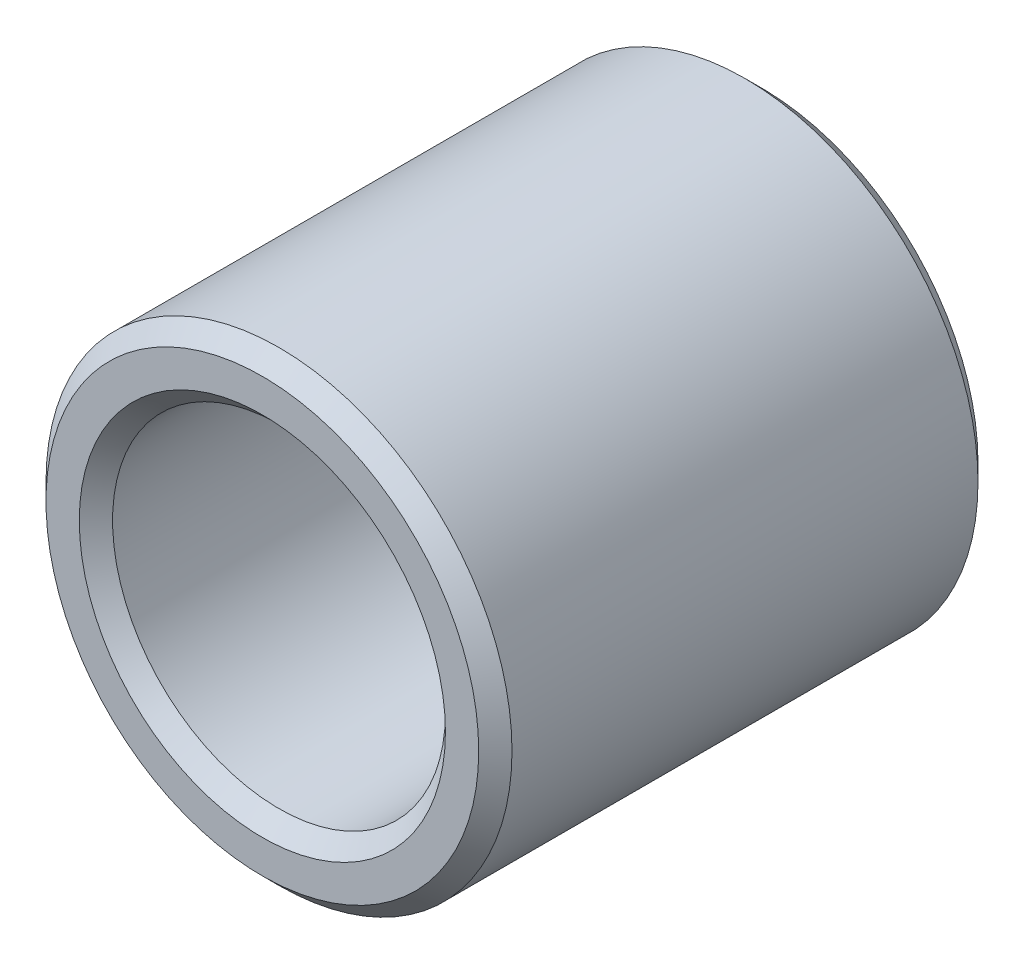
ISO-10303-21;
HEADER;
FILE_DESCRIPTION(('STEP AP214'),'2;1');
FILE_NAME('part.step','',(''),(''),'','','');
FILE_SCHEMA(('AUTOMOTIVE_DESIGN { 1 0 10303 214 1 1 1 1 }'));
ENDSEC;
DATA;
#1=APPLICATION_CONTEXT('core data for automotive mechanical design processes');
#2=APPLICATION_PROTOCOL_DEFINITION('international standard','automotive_design',2000,#1);
#3=PRODUCT_CONTEXT('',#1,'mechanical');
#4=PRODUCT('Part','Part','',(#3));
#5=PRODUCT_RELATED_PRODUCT_CATEGORY('part','',(#4));
#6=PRODUCT_DEFINITION_FORMATION('','',#4);
#7=PRODUCT_DEFINITION_CONTEXT('part definition',#1,'design');
#8=PRODUCT_DEFINITION('design','',#6,#7);
#9=PRODUCT_DEFINITION_SHAPE('','',#8);
#10=(LENGTH_UNIT() NAMED_UNIT(*) SI_UNIT(.MILLI.,.METRE.));
#11=(NAMED_UNIT(*) PLANE_ANGLE_UNIT() SI_UNIT($,.RADIAN.));
#12=(NAMED_UNIT(*) SI_UNIT($,.STERADIAN.) SOLID_ANGLE_UNIT());
#13=UNCERTAINTY_MEASURE_WITH_UNIT(LENGTH_MEASURE(1.E-05),#10,'distance_accuracy_value','');
#14=(GEOMETRIC_REPRESENTATION_CONTEXT(3) GLOBAL_UNCERTAINTY_ASSIGNED_CONTEXT((#13)) GLOBAL_UNIT_ASSIGNED_CONTEXT((#10,
#11,#12)) REPRESENTATION_CONTEXT('',''));
#15=CARTESIAN_POINT('',(0.,0.,0.));
#16=DIRECTION('',(0.,0.,1.));
#17=DIRECTION('',(1.,0.,0.));
#18=AXIS2_PLACEMENT_3D('',#15,#16,#17);
#19=CARTESIAN_POINT('',(0.,0.,15.));
#20=DIRECTION('',(0.,0.,1.));
#21=DIRECTION('',(1.,0.,0.));
#22=AXIS2_PLACEMENT_3D('',#19,#20,#21);
#23=PLANE('',#22);
#24=CARTESIAN_POINT('',(0.,0.,15.));
#25=DIRECTION('',(0.,0.,1.));
#26=DIRECTION('',(1.,0.,0.));
#27=AXIS2_PLACEMENT_3D('',#24,#25,#26);
#28=CIRCLE('',#27,5.5);
#29=CARTESIAN_POINT('',(5.5,0.,15.));
#30=VERTEX_POINT('',#29);
#31=EDGE_CURVE('E10',#30,#30,#28,.F.);
#32=ORIENTED_EDGE('',*,*,#31,.T.);
#33=EDGE_LOOP('',(#32));
#34=FACE_BOUND('',#33,.T.);
#35=CARTESIAN_POINT('',(0.,0.,15.));
#36=DIRECTION('',(0.,0.,1.));
#37=DIRECTION('',(1.,0.,0.));
#38=AXIS2_PLACEMENT_3D('',#35,#36,#37);
#39=CIRCLE('',#38,6.5);
#40=CARTESIAN_POINT('',(6.5,0.,15.));
#41=VERTEX_POINT('',#40);
#42=EDGE_CURVE('E44',#41,#41,#39,.T.);
#43=ORIENTED_EDGE('',*,*,#42,.T.);
#44=EDGE_LOOP('',(#43));
#45=FACE_BOUND('',#44,.T.);
#46=ADVANCED_FACE('F36',(#34,#45),#23,.T.);
#47=CARTESIAN_POINT('',(0.,0.,0.));
#48=DIRECTION('',(0.,0.,1.));
#49=DIRECTION('',(1.,0.,0.));
#50=AXIS2_PLACEMENT_3D('',#47,#48,#49);
#51=PLANE('',#50);
#52=CARTESIAN_POINT('',(0.,0.,0.));
#53=DIRECTION('',(0.,0.,1.));
#54=DIRECTION('',(1.,0.,0.));
#55=AXIS2_PLACEMENT_3D('',#52,#53,#54);
#56=CIRCLE('',#55,5.5);
#57=CARTESIAN_POINT('',(5.5,0.,0.));
#58=VERTEX_POINT('',#57);
#59=EDGE_CURVE('E63',#58,#58,#56,.T.);
#60=ORIENTED_EDGE('',*,*,#59,.T.);
#61=EDGE_LOOP('',(#60));
#62=FACE_BOUND('',#61,.T.);
#63=CARTESIAN_POINT('',(0.,0.,0.));
#64=DIRECTION('',(0.,0.,1.));
#65=DIRECTION('',(1.,0.,0.));
#66=AXIS2_PLACEMENT_3D('',#63,#64,#65);
#67=CIRCLE('',#66,6.5);
#68=CARTESIAN_POINT('',(6.5,0.,0.));
#69=VERTEX_POINT('',#68);
#70=EDGE_CURVE('E66',#69,#69,#67,.F.);
#71=ORIENTED_EDGE('',*,*,#70,.T.);
#72=EDGE_LOOP('',(#71));
#73=FACE_BOUND('',#72,.T.);
#74=ADVANCED_FACE('F70',(#62,#73),#51,.F.);
#75=CARTESIAN_POINT('',(0.,0.,15.));
#76=DIRECTION('',(0.,0.,-1.));
#77=DIRECTION('',(-1.,0.,0.));
#78=AXIS2_PLACEMENT_3D('',#75,#76,#77);
#79=CYLINDRICAL_SURFACE('',#78,7.);
#80=CARTESIAN_POINT('',(0.,0.,0.5));
#81=DIRECTION('',(0.,0.,1.));
#82=DIRECTION('',(1.,0.,0.));
#83=AXIS2_PLACEMENT_3D('',#80,#81,#82);
#84=CIRCLE('',#83,7.);
#85=CARTESIAN_POINT('',(7.,0.,0.5));
#86=VERTEX_POINT('',#85);
#87=EDGE_CURVE('E48',#86,#86,#84,.T.);
#88=ORIENTED_EDGE('',*,*,#87,.T.);
#89=EDGE_LOOP('',(#88));
#90=FACE_BOUND('',#89,.T.);
#91=CARTESIAN_POINT('',(0.,0.,14.5));
#92=DIRECTION('',(0.,0.,1.));
#93=DIRECTION('',(1.,0.,0.));
#94=AXIS2_PLACEMENT_3D('',#91,#92,#93);
#95=CIRCLE('',#94,7.);
#96=CARTESIAN_POINT('',(7.,0.,14.5));
#97=VERTEX_POINT('',#96);
#98=EDGE_CURVE('E52',#97,#97,#95,.F.);
#99=ORIENTED_EDGE('',*,*,#98,.T.);
#100=EDGE_LOOP('',(#99));
#101=FACE_BOUND('',#100,.T.);
#102=ADVANCED_FACE('F80',(#90,#101),#79,.T.);
#103=CARTESIAN_POINT('',(0.,0.,15.));
#104=DIRECTION('',(0.,0.,-1.));
#105=DIRECTION('',(-1.,0.,0.));
#106=AXIS2_PLACEMENT_3D('',#103,#104,#105);
#107=CYLINDRICAL_SURFACE('',#106,5.);
#108=CARTESIAN_POINT('',(0.,0.,0.499999999999997));
#109=DIRECTION('',(0.,0.,1.));
#110=DIRECTION('',(1.,0.,0.));
#111=AXIS2_PLACEMENT_3D('',#108,#109,#110);
#112=CIRCLE('',#111,5.);
#113=CARTESIAN_POINT('',(5.,0.,0.499999999999997));
#114=VERTEX_POINT('',#113);
#115=EDGE_CURVE('E57',#114,#114,#112,.F.);
#116=ORIENTED_EDGE('',*,*,#115,.T.);
#117=EDGE_LOOP('',(#116));
#118=FACE_BOUND('',#117,.T.);
#119=CARTESIAN_POINT('',(0.,0.,14.5));
#120=DIRECTION('',(0.,0.,1.));
#121=DIRECTION('',(1.,0.,0.));
#122=AXIS2_PLACEMENT_3D('',#119,#120,#121);
#123=CIRCLE('',#122,5.);
#124=CARTESIAN_POINT('',(5.,0.,14.5));
#125=VERTEX_POINT('',#124);
#126=EDGE_CURVE('E60',#125,#125,#123,.T.);
#127=ORIENTED_EDGE('',*,*,#126,.T.);
#128=EDGE_LOOP('',(#127));
#129=FACE_BOUND('',#128,.T.);
#130=ADVANCED_FACE('F83',(#118,#129),#107,.F.);
#131=CARTESIAN_POINT('',(0.,0.,0.));
#132=DIRECTION('',(0.,0.,-1.));
#133=DIRECTION('',(-1.,0.,0.));
#134=AXIS2_PLACEMENT_3D('',#131,#132,#133);
#135=CONICAL_SURFACE('',#134,5.5,0.785398163397449);
#136=ORIENTED_EDGE('',*,*,#115,.F.);
#137=EDGE_LOOP('',(#136));
#138=FACE_BOUND('',#137,.T.);
#139=ORIENTED_EDGE('',*,*,#59,.F.);
#140=EDGE_LOOP('',(#139));
#141=FACE_BOUND('',#140,.T.);
#142=ADVANCED_FACE('F76',(#138,#141),#135,.F.);
#143=CARTESIAN_POINT('',(0.,0.,0.5));
#144=DIRECTION('',(0.,0.,1.));
#145=DIRECTION('',(1.,0.,0.));
#146=AXIS2_PLACEMENT_3D('',#143,#144,#145);
#147=CONICAL_SURFACE('',#146,7.,0.785398163397451);
#148=ORIENTED_EDGE('',*,*,#70,.F.);
#149=EDGE_LOOP('',(#148));
#150=FACE_BOUND('',#149,.T.);
#151=ORIENTED_EDGE('',*,*,#87,.F.);
#152=EDGE_LOOP('',(#151));
#153=FACE_BOUND('',#152,.T.);
#154=ADVANCED_FACE('F72',(#150,#153),#147,.T.);
#155=CARTESIAN_POINT('',(0.,0.,14.5));
#156=DIRECTION('',(0.,0.,1.));
#157=DIRECTION('',(1.,0.,0.));
#158=AXIS2_PLACEMENT_3D('',#155,#156,#157);
#159=CONICAL_SURFACE('',#158,5.,0.785398163397449);
#160=ORIENTED_EDGE('',*,*,#31,.F.);
#161=EDGE_LOOP('',(#160));
#162=FACE_BOUND('',#161,.T.);
#163=ORIENTED_EDGE('',*,*,#126,.F.);
#164=EDGE_LOOP('',(#163));
#165=FACE_BOUND('',#164,.T.);
#166=ADVANCED_FACE('F75',(#162,#165),#159,.F.);
#167=CARTESIAN_POINT('',(0.,0.,15.));
#168=DIRECTION('',(0.,0.,-1.));
#169=DIRECTION('',(-1.,0.,0.));
#170=AXIS2_PLACEMENT_3D('',#167,#168,#169);
#171=CONICAL_SURFACE('',#170,6.5,0.785398163397446);
#172=ORIENTED_EDGE('',*,*,#98,.F.);
#173=EDGE_LOOP('',(#172));
#174=FACE_BOUND('',#173,.T.);
#175=ORIENTED_EDGE('',*,*,#42,.F.);
#176=EDGE_LOOP('',(#175));
#177=FACE_BOUND('',#176,.T.);
#178=ADVANCED_FACE('F39',(#174,#177),#171,.T.);
#179=CLOSED_SHELL('',(#46,#74,#102,#130,#142,#154,#166,#178));
#180=MANIFOLD_SOLID_BREP('B2',#179);
#181=ADVANCED_BREP_SHAPE_REPRESENTATION('',(#18,#180),#14);
#182=SHAPE_DEFINITION_REPRESENTATION(#9,#181);
ENDSEC;
END-ISO-10303-21;
